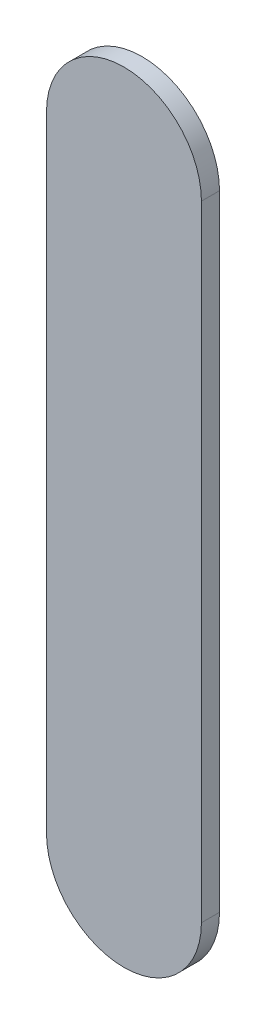
ISO-10303-21;
HEADER;
FILE_DESCRIPTION(('STEP AP214'),'2;1');
FILE_NAME('part.step','',(''),(''),'','','');
FILE_SCHEMA(('AUTOMOTIVE_DESIGN { 1 0 10303 214 1 1 1 1 }'));
ENDSEC;
DATA;
#1=APPLICATION_CONTEXT('core data for automotive mechanical design processes');
#2=APPLICATION_PROTOCOL_DEFINITION('international standard','automotive_design',2000,#1);
#3=PRODUCT_CONTEXT('',#1,'mechanical');
#4=PRODUCT('Part','Part','',(#3));
#5=PRODUCT_RELATED_PRODUCT_CATEGORY('part','',(#4));
#6=PRODUCT_DEFINITION_FORMATION('','',#4);
#7=PRODUCT_DEFINITION_CONTEXT('part definition',#1,'design');
#8=PRODUCT_DEFINITION('design','',#6,#7);
#9=PRODUCT_DEFINITION_SHAPE('','',#8);
#10=(LENGTH_UNIT() NAMED_UNIT(*) SI_UNIT(.MILLI.,.METRE.));
#11=(NAMED_UNIT(*) PLANE_ANGLE_UNIT() SI_UNIT($,.RADIAN.));
#12=(NAMED_UNIT(*) SI_UNIT($,.STERADIAN.) SOLID_ANGLE_UNIT());
#13=UNCERTAINTY_MEASURE_WITH_UNIT(LENGTH_MEASURE(1.E-05),#10,'distance_accuracy_value','');
#14=(GEOMETRIC_REPRESENTATION_CONTEXT(3) GLOBAL_UNCERTAINTY_ASSIGNED_CONTEXT((#13)) GLOBAL_UNIT_ASSIGNED_CONTEXT((#10,
#11,#12)) REPRESENTATION_CONTEXT('',''));
#15=CARTESIAN_POINT('',(0.,0.,0.));
#16=DIRECTION('',(0.,0.,1.));
#17=DIRECTION('',(1.,0.,0.));
#18=AXIS2_PLACEMENT_3D('',#15,#16,#17);
#19=CARTESIAN_POINT('',(132.018,-112.694,1.635));
#20=DIRECTION('',(0.,0.,1.));
#21=DIRECTION('',(1.,0.,0.));
#22=AXIS2_PLACEMENT_3D('',#19,#20,#21);
#23=PLANE('',#22);
#24=DIRECTION('',(0.,-1.,0.));
#25=VECTOR('',#24,1.);
#26=CARTESIAN_POINT('',(132.018,-112.694,1.635));
#27=LINE('',#26,#25);
#28=CARTESIAN_POINT('',(132.018,-112.694,1.635));
#29=VERTEX_POINT('',#28);
#30=CARTESIAN_POINT('',(132.018,-113.904,1.635));
#31=VERTEX_POINT('',#30);
#32=EDGE_CURVE('E82',#29,#31,#27,.T.);
#33=ORIENTED_EDGE('',*,*,#32,.T.);
#34=CARTESIAN_POINT('',(132.168,-113.904,1.635));
#35=DIRECTION('',(0.,0.,1.));
#36=DIRECTION('',(-1.,0.,0.));
#37=AXIS2_PLACEMENT_3D('',#34,#35,#36);
#38=CIRCLE('',#37,0.15);
#39=CARTESIAN_POINT('',(132.318,-113.904,1.635));
#40=VERTEX_POINT('',#39);
#41=EDGE_CURVE('E106',#31,#40,#38,.T.);
#42=ORIENTED_EDGE('',*,*,#41,.T.);
#43=DIRECTION('',(0.,1.,0.));
#44=VECTOR('',#43,1.);
#45=CARTESIAN_POINT('',(132.318,-113.904,1.635));
#46=LINE('',#45,#44);
#47=CARTESIAN_POINT('',(132.318,-112.694,1.635));
#48=VERTEX_POINT('',#47);
#49=EDGE_CURVE('E74',#40,#48,#46,.T.);
#50=ORIENTED_EDGE('',*,*,#49,.T.);
#51=CARTESIAN_POINT('',(132.168,-112.694,1.635));
#52=DIRECTION('',(0.,0.,1.));
#53=DIRECTION('',(1.,0.,0.));
#54=AXIS2_PLACEMENT_3D('',#51,#52,#53);
#55=CIRCLE('',#54,0.15);
#56=EDGE_CURVE('E11',#48,#29,#55,.T.);
#57=ORIENTED_EDGE('',*,*,#56,.T.);
#58=EDGE_LOOP('',(#33,#42,#50,#57));
#59=FACE_BOUND('',#58,.T.);
#60=ADVANCED_FACE('F17',(#59),#23,.T.);
#61=CARTESIAN_POINT('',(132.018,-112.694,1.6));
#62=DIRECTION('',(0.,0.,1.));
#63=DIRECTION('',(1.,0.,0.));
#64=AXIS2_PLACEMENT_3D('',#61,#62,#63);
#65=PLANE('',#64);
#66=CARTESIAN_POINT('',(132.168,-112.694,1.6));
#67=DIRECTION('',(0.,0.,1.));
#68=DIRECTION('',(1.,0.,0.));
#69=AXIS2_PLACEMENT_3D('',#66,#67,#68);
#70=CIRCLE('',#69,0.15);
#71=CARTESIAN_POINT('',(132.318,-112.694,1.6));
#72=VERTEX_POINT('',#71);
#73=CARTESIAN_POINT('',(132.018,-112.694,1.6));
#74=VERTEX_POINT('',#73);
#75=EDGE_CURVE('E25',#72,#74,#70,.T.);
#76=ORIENTED_EDGE('',*,*,#75,.F.);
#77=DIRECTION('',(0.,1.,0.));
#78=VECTOR('',#77,1.);
#79=CARTESIAN_POINT('',(132.318,-113.904,1.6));
#80=LINE('',#79,#78);
#81=CARTESIAN_POINT('',(132.318,-113.904,1.6));
#82=VERTEX_POINT('',#81);
#83=EDGE_CURVE('E109',#82,#72,#80,.T.);
#84=ORIENTED_EDGE('',*,*,#83,.F.);
#85=CARTESIAN_POINT('',(132.168,-113.904,1.6));
#86=DIRECTION('',(0.,0.,1.));
#87=DIRECTION('',(-1.,0.,0.));
#88=AXIS2_PLACEMENT_3D('',#85,#86,#87);
#89=CIRCLE('',#88,0.15);
#90=CARTESIAN_POINT('',(132.018,-113.904,1.6));
#91=VERTEX_POINT('',#90);
#92=EDGE_CURVE('E84',#91,#82,#89,.T.);
#93=ORIENTED_EDGE('',*,*,#92,.F.);
#94=DIRECTION('',(0.,-1.,0.));
#95=VECTOR('',#94,1.);
#96=CARTESIAN_POINT('',(132.018,-112.694,1.6));
#97=LINE('',#96,#95);
#98=EDGE_CURVE('E80',#74,#91,#97,.T.);
#99=ORIENTED_EDGE('',*,*,#98,.F.);
#100=EDGE_LOOP('',(#76,#84,#93,#99));
#101=FACE_BOUND('',#100,.T.);
#102=ADVANCED_FACE('F86',(#101),#65,.F.);
#103=CARTESIAN_POINT('',(132.168,-112.694,1.6));
#104=DIRECTION('',(0.,0.,-1.));
#105=DIRECTION('',(1.,0.,0.));
#106=AXIS2_PLACEMENT_3D('',#103,#104,#105);
#107=CYLINDRICAL_SURFACE('',#106,0.15);
#108=ORIENTED_EDGE('',*,*,#75,.T.);
#109=DIRECTION('',(0.,0.,1.));
#110=VECTOR('',#109,1.);
#111=CARTESIAN_POINT('',(132.018,-112.694,1.6));
#112=LINE('',#111,#110);
#113=EDGE_CURVE('E68',#74,#29,#112,.T.);
#114=ORIENTED_EDGE('',*,*,#113,.T.);
#115=ORIENTED_EDGE('',*,*,#56,.F.);
#116=DIRECTION('',(0.,0.,1.));
#117=VECTOR('',#116,1.);
#118=CARTESIAN_POINT('',(132.318,-112.694,1.6));
#119=LINE('',#118,#117);
#120=EDGE_CURVE('E71',#72,#48,#119,.T.);
#121=ORIENTED_EDGE('',*,*,#120,.F.);
#122=EDGE_LOOP('',(#108,#114,#115,#121));
#123=FACE_BOUND('',#122,.T.);
#124=ADVANCED_FACE('F67',(#123),#107,.T.);
#125=CARTESIAN_POINT('',(132.318,-113.904,1.6));
#126=DIRECTION('',(-1.,0.,0.));
#127=DIRECTION('',(0.,0.,1.));
#128=AXIS2_PLACEMENT_3D('',#125,#126,#127);
#129=PLANE('',#128);
#130=ORIENTED_EDGE('',*,*,#83,.T.);
#131=ORIENTED_EDGE('',*,*,#120,.T.);
#132=ORIENTED_EDGE('',*,*,#49,.F.);
#133=DIRECTION('',(0.,0.,1.));
#134=VECTOR('',#133,1.);
#135=CARTESIAN_POINT('',(132.318,-113.904,1.6));
#136=LINE('',#135,#134);
#137=EDGE_CURVE('E102',#82,#40,#136,.T.);
#138=ORIENTED_EDGE('',*,*,#137,.F.);
#139=EDGE_LOOP('',(#130,#131,#132,#138));
#140=FACE_BOUND('',#139,.T.);
#141=ADVANCED_FACE('F118',(#140),#129,.F.);
#142=CARTESIAN_POINT('',(132.168,-113.904,1.6));
#143=DIRECTION('',(0.,0.,-1.));
#144=DIRECTION('',(-1.,0.,0.));
#145=AXIS2_PLACEMENT_3D('',#142,#143,#144);
#146=CYLINDRICAL_SURFACE('',#145,0.15);
#147=ORIENTED_EDGE('',*,*,#92,.T.);
#148=ORIENTED_EDGE('',*,*,#137,.T.);
#149=ORIENTED_EDGE('',*,*,#41,.F.);
#150=DIRECTION('',(0.,0.,1.));
#151=VECTOR('',#150,1.);
#152=CARTESIAN_POINT('',(132.018,-113.904,1.6));
#153=LINE('',#152,#151);
#154=EDGE_CURVE('E90',#91,#31,#153,.T.);
#155=ORIENTED_EDGE('',*,*,#154,.F.);
#156=EDGE_LOOP('',(#147,#148,#149,#155));
#157=FACE_BOUND('',#156,.T.);
#158=ADVANCED_FACE('F121',(#157),#146,.T.);
#159=CARTESIAN_POINT('',(132.018,-112.694,1.6));
#160=DIRECTION('',(1.,0.,0.));
#161=DIRECTION('',(0.,1.,0.));
#162=AXIS2_PLACEMENT_3D('',#159,#160,#161);
#163=PLANE('',#162);
#164=ORIENTED_EDGE('',*,*,#98,.T.);
#165=ORIENTED_EDGE('',*,*,#154,.T.);
#166=ORIENTED_EDGE('',*,*,#32,.F.);
#167=ORIENTED_EDGE('',*,*,#113,.F.);
#168=EDGE_LOOP('',(#164,#165,#166,#167));
#169=FACE_BOUND('',#168,.T.);
#170=ADVANCED_FACE('F78',(#169),#163,.F.);
#171=CLOSED_SHELL('',(#60,#102,#124,#141,#158,#170));
#172=MANIFOLD_SOLID_BREP('B1',#171);
#173=ADVANCED_BREP_SHAPE_REPRESENTATION('',(#18,#172),#14);
#174=SHAPE_DEFINITION_REPRESENTATION(#9,#173);
ENDSEC;
END-ISO-10303-21;
